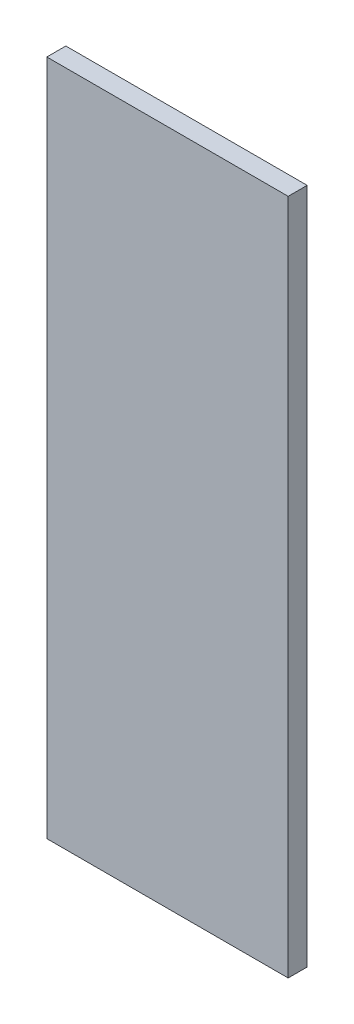
ISO-10303-21;
HEADER;
FILE_DESCRIPTION(('STEP AP214'),'2;1');
FILE_NAME('part.step','',(''),(''),'','','');
FILE_SCHEMA(('AUTOMOTIVE_DESIGN { 1 0 10303 214 1 1 1 1 }'));
ENDSEC;
DATA;
#1=APPLICATION_CONTEXT('core data for automotive mechanical design processes');
#2=APPLICATION_PROTOCOL_DEFINITION('international standard','automotive_design',2000,#1);
#3=PRODUCT_CONTEXT('',#1,'mechanical');
#4=PRODUCT('Part','Part','',(#3));
#5=PRODUCT_RELATED_PRODUCT_CATEGORY('part','',(#4));
#6=PRODUCT_DEFINITION_FORMATION('','',#4);
#7=PRODUCT_DEFINITION_CONTEXT('part definition',#1,'design');
#8=PRODUCT_DEFINITION('design','',#6,#7);
#9=PRODUCT_DEFINITION_SHAPE('','',#8);
#10=(LENGTH_UNIT() NAMED_UNIT(*) SI_UNIT(.MILLI.,.METRE.));
#11=(NAMED_UNIT(*) PLANE_ANGLE_UNIT() SI_UNIT($,.RADIAN.));
#12=(NAMED_UNIT(*) SI_UNIT($,.STERADIAN.) SOLID_ANGLE_UNIT());
#13=UNCERTAINTY_MEASURE_WITH_UNIT(LENGTH_MEASURE(1.E-05),#10,'distance_accuracy_value','');
#14=(GEOMETRIC_REPRESENTATION_CONTEXT(3) GLOBAL_UNCERTAINTY_ASSIGNED_CONTEXT((#13)) GLOBAL_UNIT_ASSIGNED_CONTEXT((#10,
#11,#12)) REPRESENTATION_CONTEXT('',''));
#15=CARTESIAN_POINT('',(0.,0.,0.));
#16=DIRECTION('',(0.,0.,1.));
#17=DIRECTION('',(1.,0.,0.));
#18=AXIS2_PLACEMENT_3D('',#15,#16,#17);
#19=CARTESIAN_POINT('',(0.,0.,1.6));
#20=DIRECTION('',(1.,0.,0.));
#21=DIRECTION('',(0.,1.,0.));
#22=AXIS2_PLACEMENT_3D('',#19,#20,#21);
#23=PLANE('',#22);
#24=DIRECTION('',(0.,-1.,0.));
#25=VECTOR('',#24,1.);
#26=CARTESIAN_POINT('',(0.,0.,0.));
#27=LINE('',#26,#25);
#28=CARTESIAN_POINT('',(0.,57.,0.));
#29=VERTEX_POINT('',#28);
#30=CARTESIAN_POINT('',(0.,0.,0.));
#31=VERTEX_POINT('',#30);
#32=EDGE_CURVE('E131',#29,#31,#27,.T.);
#33=ORIENTED_EDGE('',*,*,#32,.T.);
#34=DIRECTION('',(0.,0.,-1.));
#35=VECTOR('',#34,1.);
#36=CARTESIAN_POINT('',(0.,0.,1.6));
#37=LINE('',#36,#35);
#38=CARTESIAN_POINT('',(0.,0.,1.6));
#39=VERTEX_POINT('',#38);
#40=EDGE_CURVE('E156',#39,#31,#37,.T.);
#41=ORIENTED_EDGE('',*,*,#40,.F.);
#42=DIRECTION('',(0.,-1.,0.));
#43=VECTOR('',#42,1.);
#44=CARTESIAN_POINT('',(0.,0.,1.6));
#45=LINE('',#44,#43);
#46=CARTESIAN_POINT('',(0.,57.,1.6));
#47=VERTEX_POINT('',#46);
#48=EDGE_CURVE('E136',#47,#39,#45,.T.);
#49=ORIENTED_EDGE('',*,*,#48,.F.);
#50=DIRECTION('',(0.,0.,-1.));
#51=VECTOR('',#50,1.);
#52=CARTESIAN_POINT('',(0.,57.,1.6));
#53=LINE('',#52,#51);
#54=EDGE_CURVE('E142',#47,#29,#53,.T.);
#55=ORIENTED_EDGE('',*,*,#54,.T.);
#56=EDGE_LOOP('',(#33,#41,#49,#55));
#57=FACE_BOUND('',#56,.T.);
#58=ADVANCED_FACE('F33',(#57),#23,.F.);
#59=CARTESIAN_POINT('',(0.,0.,1.6));
#60=DIRECTION('',(0.,1.,0.));
#61=DIRECTION('',(0.,0.,1.));
#62=AXIS2_PLACEMENT_3D('',#59,#60,#61);
#63=PLANE('',#62);
#64=DIRECTION('',(0.,0.,-1.));
#65=VECTOR('',#64,1.);
#66=CARTESIAN_POINT('',(20.32,0.,1.6));
#67=LINE('',#66,#65);
#68=CARTESIAN_POINT('',(20.32,0.,1.6));
#69=VERTEX_POINT('',#68);
#70=CARTESIAN_POINT('',(20.32,0.,0.));
#71=VERTEX_POINT('',#70);
#72=EDGE_CURVE('E153',#69,#71,#67,.T.);
#73=ORIENTED_EDGE('',*,*,#72,.F.);
#74=DIRECTION('',(1.,0.,0.));
#75=VECTOR('',#74,1.);
#76=CARTESIAN_POINT('',(0.,0.,1.6));
#77=LINE('',#76,#75);
#78=EDGE_CURVE('E83',#39,#69,#77,.T.);
#79=ORIENTED_EDGE('',*,*,#78,.F.);
#80=ORIENTED_EDGE('',*,*,#40,.T.);
#81=DIRECTION('',(1.,0.,0.));
#82=VECTOR('',#81,1.);
#83=CARTESIAN_POINT('',(0.,0.,0.));
#84=LINE('',#83,#82);
#85=CARTESIAN_POINT('',(6.68310108845168,0.,0.));
#86=VERTEX_POINT('',#85);
#87=EDGE_CURVE('E107',#31,#86,#84,.T.);
#88=ORIENTED_EDGE('',*,*,#87,.T.);
#89=DIRECTION('',(0.,0.,1.));
#90=VECTOR('',#89,1.);
#91=CARTESIAN_POINT('',(6.68310108845168,0.,-4.4));
#92=LINE('',#91,#90);
#93=CARTESIAN_POINT('',(6.68310108845168,0.,-4.4));
#94=VERTEX_POINT('',#93);
#95=EDGE_CURVE('E103',#94,#86,#92,.T.);
#96=ORIENTED_EDGE('',*,*,#95,.F.);
#97=DIRECTION('',(1.,0.,0.));
#98=VECTOR('',#97,1.);
#99=CARTESIAN_POINT('',(6.68310108845168,0.,-4.4));
#100=LINE('',#99,#98);
#101=CARTESIAN_POINT('',(15.0999819844323,0.,-4.4));
#102=VERTEX_POINT('',#101);
#103=EDGE_CURVE('E106',#94,#102,#100,.T.);
#104=ORIENTED_EDGE('',*,*,#103,.T.);
#105=DIRECTION('',(0.,0.,1.));
#106=VECTOR('',#105,1.);
#107=CARTESIAN_POINT('',(15.0999819844323,0.,-4.4));
#108=LINE('',#107,#106);
#109=CARTESIAN_POINT('',(15.0999819844323,0.,0.));
#110=VERTEX_POINT('',#109);
#111=EDGE_CURVE('E47',#102,#110,#108,.T.);
#112=ORIENTED_EDGE('',*,*,#111,.T.);
#113=EDGE_CURVE('E145',#110,#71,#84,.T.);
#114=ORIENTED_EDGE('',*,*,#113,.T.);
#115=EDGE_LOOP('',(#73,#79,#80,#88,#96,#104,#112,#114));
#116=FACE_BOUND('',#115,.T.);
#117=ADVANCED_FACE('F105',(#116),#63,.F.);
#118=CARTESIAN_POINT('',(20.32,0.,1.6));
#119=DIRECTION('',(-1.,0.,0.));
#120=DIRECTION('',(0.,-1.,0.));
#121=AXIS2_PLACEMENT_3D('',#118,#119,#120);
#122=PLANE('',#121);
#123=DIRECTION('',(0.,1.,0.));
#124=VECTOR('',#123,1.);
#125=CARTESIAN_POINT('',(20.32,0.,0.));
#126=LINE('',#125,#124);
#127=CARTESIAN_POINT('',(20.32,57.,0.));
#128=VERTEX_POINT('',#127);
#129=EDGE_CURVE('E147',#71,#128,#126,.T.);
#130=ORIENTED_EDGE('',*,*,#129,.T.);
#131=DIRECTION('',(0.,0.,-1.));
#132=VECTOR('',#131,1.);
#133=CARTESIAN_POINT('',(20.32,57.,1.6));
#134=LINE('',#133,#132);
#135=CARTESIAN_POINT('',(20.32,57.,1.6));
#136=VERTEX_POINT('',#135);
#137=EDGE_CURVE('E151',#136,#128,#134,.T.);
#138=ORIENTED_EDGE('',*,*,#137,.F.);
#139=DIRECTION('',(0.,1.,0.));
#140=VECTOR('',#139,1.);
#141=CARTESIAN_POINT('',(20.32,0.,1.6));
#142=LINE('',#141,#140);
#143=EDGE_CURVE('E139',#69,#136,#142,.T.);
#144=ORIENTED_EDGE('',*,*,#143,.F.);
#145=ORIENTED_EDGE('',*,*,#72,.T.);
#146=EDGE_LOOP('',(#130,#138,#144,#145));
#147=FACE_BOUND('',#146,.T.);
#148=ADVANCED_FACE('F171',(#147),#122,.F.);
#149=CARTESIAN_POINT('',(0.,57.,1.6));
#150=DIRECTION('',(0.,-1.,0.));
#151=DIRECTION('',(0.,0.,-1.));
#152=AXIS2_PLACEMENT_3D('',#149,#150,#151);
#153=PLANE('',#152);
#154=DIRECTION('',(-1.,0.,0.));
#155=VECTOR('',#154,1.);
#156=CARTESIAN_POINT('',(0.,57.,0.));
#157=LINE('',#156,#155);
#158=EDGE_CURVE('E76',#128,#29,#157,.T.);
#159=ORIENTED_EDGE('',*,*,#158,.T.);
#160=ORIENTED_EDGE('',*,*,#54,.F.);
#161=DIRECTION('',(-1.,0.,0.));
#162=VECTOR('',#161,1.);
#163=CARTESIAN_POINT('',(0.,57.,1.6));
#164=LINE('',#163,#162);
#165=EDGE_CURVE('E56',#136,#47,#164,.T.);
#166=ORIENTED_EDGE('',*,*,#165,.F.);
#167=ORIENTED_EDGE('',*,*,#137,.T.);
#168=EDGE_LOOP('',(#159,#160,#166,#167));
#169=FACE_BOUND('',#168,.T.);
#170=ADVANCED_FACE('F178',(#169),#153,.F.);
#171=CARTESIAN_POINT('',(0.,0.,1.6));
#172=DIRECTION('',(0.,0.,-1.));
#173=DIRECTION('',(-1.,0.,0.));
#174=AXIS2_PLACEMENT_3D('',#171,#172,#173);
#175=PLANE('',#174);
#176=ORIENTED_EDGE('',*,*,#78,.T.);
#177=ORIENTED_EDGE('',*,*,#143,.T.);
#178=ORIENTED_EDGE('',*,*,#165,.T.);
#179=ORIENTED_EDGE('',*,*,#48,.T.);
#180=EDGE_LOOP('',(#176,#177,#178,#179));
#181=FACE_BOUND('',#180,.T.);
#182=ADVANCED_FACE('F173',(#181),#175,.F.);
#183=CARTESIAN_POINT('',(0.,0.,0.));
#184=DIRECTION('',(0.,0.,-1.));
#185=DIRECTION('',(-1.,0.,0.));
#186=AXIS2_PLACEMENT_3D('',#183,#184,#185);
#187=PLANE('',#186);
#188=DIRECTION('',(0.,1.,0.));
#189=VECTOR('',#188,1.);
#190=CARTESIAN_POINT('',(6.68310108845168,0.,0.));
#191=LINE('',#190,#189);
#192=CARTESIAN_POINT('',(6.68310108845168,4.,0.));
#193=VERTEX_POINT('',#192);
#194=EDGE_CURVE('E11',#86,#193,#191,.T.);
#195=ORIENTED_EDGE('',*,*,#194,.F.);
#196=ORIENTED_EDGE('',*,*,#87,.F.);
#197=ORIENTED_EDGE('',*,*,#32,.F.);
#198=ORIENTED_EDGE('',*,*,#158,.F.);
#199=ORIENTED_EDGE('',*,*,#129,.F.);
#200=ORIENTED_EDGE('',*,*,#113,.F.);
#201=DIRECTION('',(0.,-1.,0.));
#202=VECTOR('',#201,1.);
#203=CARTESIAN_POINT('',(15.0999819844323,0.,0.));
#204=LINE('',#203,#202);
#205=CARTESIAN_POINT('',(15.0999819844323,4.,0.));
#206=VERTEX_POINT('',#205);
#207=EDGE_CURVE('E158',#206,#110,#204,.T.);
#208=ORIENTED_EDGE('',*,*,#207,.F.);
#209=DIRECTION('',(1.,0.,0.));
#210=VECTOR('',#209,1.);
#211=CARTESIAN_POINT('',(0.,4.,0.));
#212=LINE('',#211,#210);
#213=EDGE_CURVE('E40',#193,#206,#212,.T.);
#214=ORIENTED_EDGE('',*,*,#213,.F.);
#215=EDGE_LOOP('',(#195,#196,#197,#198,#199,#200,#208,#214));
#216=FACE_BOUND('',#215,.T.);
#217=ADVANCED_FACE('F167',(#216),#187,.T.);
#218=CARTESIAN_POINT('',(6.68310108845168,0.,-4.4));
#219=DIRECTION('',(-1.,0.,0.));
#220=DIRECTION('',(0.,0.,1.));
#221=AXIS2_PLACEMENT_3D('',#218,#219,#220);
#222=PLANE('',#221);
#223=ORIENTED_EDGE('',*,*,#95,.T.);
#224=ORIENTED_EDGE('',*,*,#194,.T.);
#225=DIRECTION('',(0.,0.,1.));
#226=VECTOR('',#225,1.);
#227=CARTESIAN_POINT('',(6.68310108845168,4.,-4.4));
#228=LINE('',#227,#226);
#229=CARTESIAN_POINT('',(6.68310108845168,4.,-4.4));
#230=VERTEX_POINT('',#229);
#231=EDGE_CURVE('E125',#230,#193,#228,.T.);
#232=ORIENTED_EDGE('',*,*,#231,.F.);
#233=DIRECTION('',(0.,-1.,0.));
#234=VECTOR('',#233,1.);
#235=CARTESIAN_POINT('',(6.68310108845168,0.,-4.4));
#236=LINE('',#235,#234);
#237=EDGE_CURVE('E118',#230,#94,#236,.T.);
#238=ORIENTED_EDGE('',*,*,#237,.T.);
#239=EDGE_LOOP('',(#223,#224,#232,#238));
#240=FACE_BOUND('',#239,.T.);
#241=ADVANCED_FACE('F123',(#240),#222,.T.);
#242=CARTESIAN_POINT('',(6.68310108845168,4.,-4.4));
#243=DIRECTION('',(0.,1.,0.));
#244=DIRECTION('',(0.,0.,1.));
#245=AXIS2_PLACEMENT_3D('',#242,#243,#244);
#246=PLANE('',#245);
#247=ORIENTED_EDGE('',*,*,#231,.T.);
#248=ORIENTED_EDGE('',*,*,#213,.T.);
#249=DIRECTION('',(0.,0.,1.));
#250=VECTOR('',#249,1.);
#251=CARTESIAN_POINT('',(15.0999819844323,4.,-4.4));
#252=LINE('',#251,#250);
#253=CARTESIAN_POINT('',(15.0999819844323,4.,-4.4));
#254=VERTEX_POINT('',#253);
#255=EDGE_CURVE('E132',#254,#206,#252,.T.);
#256=ORIENTED_EDGE('',*,*,#255,.F.);
#257=DIRECTION('',(-1.,0.,0.));
#258=VECTOR('',#257,1.);
#259=CARTESIAN_POINT('',(6.68310108845168,4.,-4.4));
#260=LINE('',#259,#258);
#261=EDGE_CURVE('E111',#254,#230,#260,.T.);
#262=ORIENTED_EDGE('',*,*,#261,.T.);
#263=EDGE_LOOP('',(#247,#248,#256,#262));
#264=FACE_BOUND('',#263,.T.);
#265=ADVANCED_FACE('F161',(#264),#246,.T.);
#266=CARTESIAN_POINT('',(15.0999819844323,0.,-4.4));
#267=DIRECTION('',(1.,0.,0.));
#268=DIRECTION('',(0.,0.,-1.));
#269=AXIS2_PLACEMENT_3D('',#266,#267,#268);
#270=PLANE('',#269);
#271=ORIENTED_EDGE('',*,*,#255,.T.);
#272=ORIENTED_EDGE('',*,*,#207,.T.);
#273=ORIENTED_EDGE('',*,*,#111,.F.);
#274=DIRECTION('',(0.,1.,0.));
#275=VECTOR('',#274,1.);
#276=CARTESIAN_POINT('',(15.0999819844323,0.,-4.4));
#277=LINE('',#276,#275);
#278=EDGE_CURVE('E121',#102,#254,#277,.T.);
#279=ORIENTED_EDGE('',*,*,#278,.T.);
#280=EDGE_LOOP('',(#271,#272,#273,#279));
#281=FACE_BOUND('',#280,.T.);
#282=ADVANCED_FACE('F165',(#281),#270,.T.);
#283=CARTESIAN_POINT('',(0.,0.,-4.4));
#284=DIRECTION('',(0.,0.,-1.));
#285=DIRECTION('',(-1.,0.,0.));
#286=AXIS2_PLACEMENT_3D('',#283,#284,#285);
#287=PLANE('',#286);
#288=ORIENTED_EDGE('',*,*,#237,.F.);
#289=ORIENTED_EDGE('',*,*,#261,.F.);
#290=ORIENTED_EDGE('',*,*,#278,.F.);
#291=ORIENTED_EDGE('',*,*,#103,.F.);
#292=EDGE_LOOP('',(#288,#289,#290,#291));
#293=FACE_BOUND('',#292,.T.);
#294=ADVANCED_FACE('F116',(#293),#287,.T.);
#295=CLOSED_SHELL('',(#58,#117,#148,#170,#182,#217,#241,#265,#282,#294));
#296=MANIFOLD_SOLID_BREP('B2',#295);
#297=ADVANCED_BREP_SHAPE_REPRESENTATION('',(#18,#296),#14);
#298=SHAPE_DEFINITION_REPRESENTATION(#9,#297);
ENDSEC;
END-ISO-10303-21;
